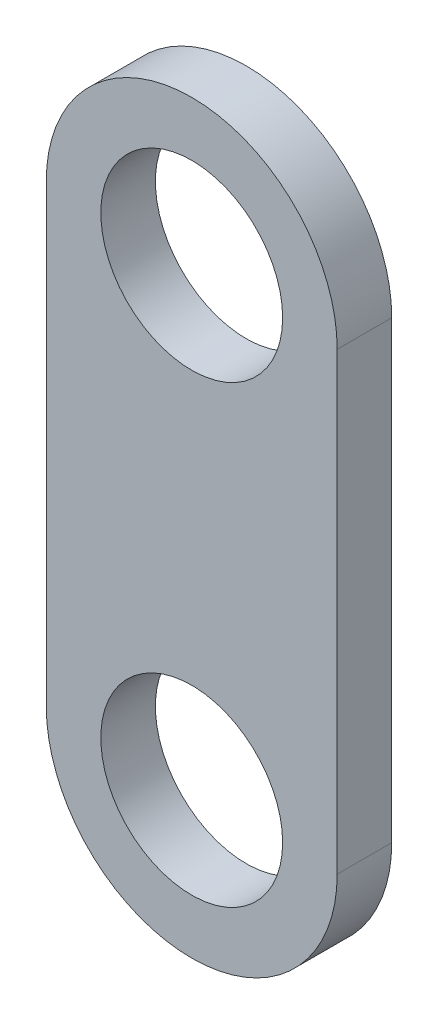
ISO-10303-21;
HEADER;
FILE_DESCRIPTION(('STEP AP214'),'2;1');
FILE_NAME('part.step','',(''),(''),'','','');
FILE_SCHEMA(('AUTOMOTIVE_DESIGN { 1 0 10303 214 1 1 1 1 }'));
ENDSEC;
DATA;
#1=APPLICATION_CONTEXT('core data for automotive mechanical design processes');
#2=APPLICATION_PROTOCOL_DEFINITION('international standard','automotive_design',2000,#1);
#3=PRODUCT_CONTEXT('',#1,'mechanical');
#4=PRODUCT('Part','Part','',(#3));
#5=PRODUCT_RELATED_PRODUCT_CATEGORY('part','',(#4));
#6=PRODUCT_DEFINITION_FORMATION('','',#4);
#7=PRODUCT_DEFINITION_CONTEXT('part definition',#1,'design');
#8=PRODUCT_DEFINITION('design','',#6,#7);
#9=PRODUCT_DEFINITION_SHAPE('','',#8);
#10=(LENGTH_UNIT() NAMED_UNIT(*) SI_UNIT(.MILLI.,.METRE.));
#11=(NAMED_UNIT(*) PLANE_ANGLE_UNIT() SI_UNIT($,.RADIAN.));
#12=(NAMED_UNIT(*) SI_UNIT($,.STERADIAN.) SOLID_ANGLE_UNIT());
#13=UNCERTAINTY_MEASURE_WITH_UNIT(LENGTH_MEASURE(1.E-05),#10,'distance_accuracy_value','');
#14=(GEOMETRIC_REPRESENTATION_CONTEXT(3) GLOBAL_UNCERTAINTY_ASSIGNED_CONTEXT((#13)) GLOBAL_UNIT_ASSIGNED_CONTEXT((#10,
#11,#12)) REPRESENTATION_CONTEXT('',''));
#15=CARTESIAN_POINT('',(0.,0.,0.));
#16=DIRECTION('',(0.,0.,1.));
#17=DIRECTION('',(1.,0.,0.));
#18=AXIS2_PLACEMENT_3D('',#15,#16,#17);
#19=CARTESIAN_POINT('',(0.,-1.25,0.3));
#20=DIRECTION('',(0.,0.,1.));
#21=DIRECTION('',(1.,0.,0.));
#22=AXIS2_PLACEMENT_3D('',#19,#20,#21);
#23=PLANE('',#22);
#24=CARTESIAN_POINT('',(0.,1.25,0.3));
#25=DIRECTION('',(0.,0.,1.));
#26=DIRECTION('',(1.,0.,0.));
#27=AXIS2_PLACEMENT_3D('',#24,#25,#26);
#28=CIRCLE('',#27,0.5);
#29=CARTESIAN_POINT('',(0.5,1.25,0.3));
#30=VERTEX_POINT('',#29);
#31=EDGE_CURVE('E99',#30,#30,#28,.T.);
#32=ORIENTED_EDGE('',*,*,#31,.F.);
#33=EDGE_LOOP('',(#32));
#34=FACE_BOUND('',#33,.T.);
#35=CARTESIAN_POINT('',(0.,-1.25,0.3));
#36=DIRECTION('',(0.,0.,1.));
#37=DIRECTION('',(1.,0.,0.));
#38=AXIS2_PLACEMENT_3D('',#35,#36,#37);
#39=CIRCLE('',#38,0.8);
#40=CARTESIAN_POINT('',(-0.8,-1.25,0.3));
#41=VERTEX_POINT('',#40);
#42=CARTESIAN_POINT('',(0.8,-1.25,0.3));
#43=VERTEX_POINT('',#42);
#44=EDGE_CURVE('E84',#41,#43,#39,.T.);
#45=ORIENTED_EDGE('',*,*,#44,.T.);
#46=DIRECTION('',(0.,1.,0.));
#47=VECTOR('',#46,1.);
#48=CARTESIAN_POINT('',(0.8,-1.25,0.3));
#49=LINE('',#48,#47);
#50=CARTESIAN_POINT('',(0.8,1.25,0.3));
#51=VERTEX_POINT('',#50);
#52=EDGE_CURVE('E79',#43,#51,#49,.T.);
#53=ORIENTED_EDGE('',*,*,#52,.T.);
#54=CARTESIAN_POINT('',(0.,1.25,0.3));
#55=DIRECTION('',(0.,0.,1.));
#56=DIRECTION('',(1.,0.,0.));
#57=AXIS2_PLACEMENT_3D('',#54,#55,#56);
#58=CIRCLE('',#57,0.8);
#59=CARTESIAN_POINT('',(-0.800000000000001,1.25,0.3));
#60=VERTEX_POINT('',#59);
#61=EDGE_CURVE('E82',#51,#60,#58,.T.);
#62=ORIENTED_EDGE('',*,*,#61,.T.);
#63=DIRECTION('',(0.,-1.,0.));
#64=VECTOR('',#63,1.);
#65=CARTESIAN_POINT('',(-0.8,-1.25,0.3));
#66=LINE('',#65,#64);
#67=EDGE_CURVE('E49',#60,#41,#66,.T.);
#68=ORIENTED_EDGE('',*,*,#67,.T.);
#69=EDGE_LOOP('',(#45,#53,#62,#68));
#70=FACE_BOUND('',#69,.T.);
#71=CARTESIAN_POINT('',(0.,-1.25,0.3));
#72=DIRECTION('',(0.,0.,1.));
#73=DIRECTION('',(1.,0.,0.));
#74=AXIS2_PLACEMENT_3D('',#71,#72,#73);
#75=CIRCLE('',#74,0.5);
#76=CARTESIAN_POINT('',(0.5,-1.25,0.3));
#77=VERTEX_POINT('',#76);
#78=EDGE_CURVE('E114',#77,#77,#75,.T.);
#79=ORIENTED_EDGE('',*,*,#78,.F.);
#80=EDGE_LOOP('',(#79));
#81=FACE_BOUND('',#80,.T.);
#82=ADVANCED_FACE('F32',(#34,#70,#81),#23,.T.);
#83=CARTESIAN_POINT('',(0.,-1.25,0.));
#84=DIRECTION('',(0.,0.,1.));
#85=DIRECTION('',(1.,0.,0.));
#86=AXIS2_PLACEMENT_3D('',#83,#84,#85);
#87=PLANE('',#86);
#88=CARTESIAN_POINT('',(0.,-1.25,0.));
#89=DIRECTION('',(0.,0.,1.));
#90=DIRECTION('',(1.,0.,0.));
#91=AXIS2_PLACEMENT_3D('',#88,#89,#90);
#92=CIRCLE('',#91,0.8);
#93=CARTESIAN_POINT('',(-0.8,-1.25,0.));
#94=VERTEX_POINT('',#93);
#95=CARTESIAN_POINT('',(0.8,-1.25,0.));
#96=VERTEX_POINT('',#95);
#97=EDGE_CURVE('E96',#94,#96,#92,.T.);
#98=ORIENTED_EDGE('',*,*,#97,.F.);
#99=DIRECTION('',(0.,-1.,0.));
#100=VECTOR('',#99,1.);
#101=CARTESIAN_POINT('',(-0.8,-1.25,0.));
#102=LINE('',#101,#100);
#103=CARTESIAN_POINT('',(-0.800000000000001,1.25,0.));
#104=VERTEX_POINT('',#103);
#105=EDGE_CURVE('E72',#104,#94,#102,.T.);
#106=ORIENTED_EDGE('',*,*,#105,.F.);
#107=CARTESIAN_POINT('',(0.,1.25,0.));
#108=DIRECTION('',(0.,0.,1.));
#109=DIRECTION('',(1.,0.,0.));
#110=AXIS2_PLACEMENT_3D('',#107,#108,#109);
#111=CIRCLE('',#110,0.8);
#112=CARTESIAN_POINT('',(0.8,1.25,0.));
#113=VERTEX_POINT('',#112);
#114=EDGE_CURVE('E66',#113,#104,#111,.T.);
#115=ORIENTED_EDGE('',*,*,#114,.F.);
#116=DIRECTION('',(0.,1.,0.));
#117=VECTOR('',#116,1.);
#118=CARTESIAN_POINT('',(0.8,-1.25,0.));
#119=LINE('',#118,#117);
#120=EDGE_CURVE('E88',#96,#113,#119,.T.);
#121=ORIENTED_EDGE('',*,*,#120,.F.);
#122=EDGE_LOOP('',(#98,#106,#115,#121));
#123=FACE_BOUND('',#122,.T.);
#124=CARTESIAN_POINT('',(0.,1.25,0.));
#125=DIRECTION('',(0.,0.,1.));
#126=DIRECTION('',(1.,0.,0.));
#127=AXIS2_PLACEMENT_3D('',#124,#125,#126);
#128=CIRCLE('',#127,0.5);
#129=CARTESIAN_POINT('',(0.5,1.25,0.));
#130=VERTEX_POINT('',#129);
#131=EDGE_CURVE('E111',#130,#130,#128,.T.);
#132=ORIENTED_EDGE('',*,*,#131,.T.);
#133=EDGE_LOOP('',(#132));
#134=FACE_BOUND('',#133,.T.);
#135=CARTESIAN_POINT('',(0.,-1.25,0.));
#136=DIRECTION('',(0.,0.,1.));
#137=DIRECTION('',(1.,0.,0.));
#138=AXIS2_PLACEMENT_3D('',#135,#136,#137);
#139=CIRCLE('',#138,0.5);
#140=CARTESIAN_POINT('',(0.5,-1.25,0.));
#141=VERTEX_POINT('',#140);
#142=EDGE_CURVE('E117',#141,#141,#139,.T.);
#143=ORIENTED_EDGE('',*,*,#142,.T.);
#144=EDGE_LOOP('',(#143));
#145=FACE_BOUND('',#144,.T.);
#146=ADVANCED_FACE('F107',(#123,#134,#145),#87,.F.);
#147=CARTESIAN_POINT('',(0.,-1.25,0.3));
#148=DIRECTION('',(0.,0.,-1.));
#149=DIRECTION('',(-1.,0.,0.));
#150=AXIS2_PLACEMENT_3D('',#147,#148,#149);
#151=CYLINDRICAL_SURFACE('',#150,0.8);
#152=ORIENTED_EDGE('',*,*,#97,.T.);
#153=DIRECTION('',(0.,0.,-1.));
#154=VECTOR('',#153,1.);
#155=CARTESIAN_POINT('',(0.8,-1.25,0.3));
#156=LINE('',#155,#154);
#157=EDGE_CURVE('E11',#43,#96,#156,.T.);
#158=ORIENTED_EDGE('',*,*,#157,.F.);
#159=ORIENTED_EDGE('',*,*,#44,.F.);
#160=DIRECTION('',(0.,0.,-1.));
#161=VECTOR('',#160,1.);
#162=CARTESIAN_POINT('',(-0.8,-1.25,0.3));
#163=LINE('',#162,#161);
#164=EDGE_CURVE('E92',#41,#94,#163,.T.);
#165=ORIENTED_EDGE('',*,*,#164,.T.);
#166=EDGE_LOOP('',(#152,#158,#159,#165));
#167=FACE_BOUND('',#166,.T.);
#168=ADVANCED_FACE('F34',(#167),#151,.T.);
#169=CARTESIAN_POINT('',(0.8,-1.25,0.3));
#170=DIRECTION('',(-1.,0.,0.));
#171=DIRECTION('',(0.,-1.,0.));
#172=AXIS2_PLACEMENT_3D('',#169,#170,#171);
#173=PLANE('',#172);
#174=ORIENTED_EDGE('',*,*,#120,.T.);
#175=DIRECTION('',(0.,0.,-1.));
#176=VECTOR('',#175,1.);
#177=CARTESIAN_POINT('',(0.8,1.25,0.3));
#178=LINE('',#177,#176);
#179=EDGE_CURVE('E41',#51,#113,#178,.T.);
#180=ORIENTED_EDGE('',*,*,#179,.F.);
#181=ORIENTED_EDGE('',*,*,#52,.F.);
#182=ORIENTED_EDGE('',*,*,#157,.T.);
#183=EDGE_LOOP('',(#174,#180,#181,#182));
#184=FACE_BOUND('',#183,.T.);
#185=ADVANCED_FACE('F87',(#184),#173,.F.);
#186=CARTESIAN_POINT('',(0.,1.25,0.3));
#187=DIRECTION('',(0.,0.,-1.));
#188=DIRECTION('',(-1.,0.,0.));
#189=AXIS2_PLACEMENT_3D('',#186,#187,#188);
#190=CYLINDRICAL_SURFACE('',#189,0.8);
#191=ORIENTED_EDGE('',*,*,#114,.T.);
#192=DIRECTION('',(0.,0.,-1.));
#193=VECTOR('',#192,1.);
#194=CARTESIAN_POINT('',(-0.800000000000001,1.25,0.3));
#195=LINE('',#194,#193);
#196=EDGE_CURVE('E89',#60,#104,#195,.T.);
#197=ORIENTED_EDGE('',*,*,#196,.F.);
#198=ORIENTED_EDGE('',*,*,#61,.F.);
#199=ORIENTED_EDGE('',*,*,#179,.T.);
#200=EDGE_LOOP('',(#191,#197,#198,#199));
#201=FACE_BOUND('',#200,.T.);
#202=ADVANCED_FACE('F90',(#201),#190,.T.);
#203=CARTESIAN_POINT('',(-0.8,-1.25,0.3));
#204=DIRECTION('',(1.,0.,0.));
#205=DIRECTION('',(0.,1.,0.));
#206=AXIS2_PLACEMENT_3D('',#203,#204,#205);
#207=PLANE('',#206);
#208=ORIENTED_EDGE('',*,*,#105,.T.);
#209=ORIENTED_EDGE('',*,*,#164,.F.);
#210=ORIENTED_EDGE('',*,*,#67,.F.);
#211=ORIENTED_EDGE('',*,*,#196,.T.);
#212=EDGE_LOOP('',(#208,#209,#210,#211));
#213=FACE_BOUND('',#212,.T.);
#214=ADVANCED_FACE('F104',(#213),#207,.F.);
#215=CARTESIAN_POINT('',(0.,1.25,0.3));
#216=DIRECTION('',(0.,0.,-1.));
#217=DIRECTION('',(-1.,0.,0.));
#218=AXIS2_PLACEMENT_3D('',#215,#216,#217);
#219=CYLINDRICAL_SURFACE('',#218,0.5);
#220=ORIENTED_EDGE('',*,*,#31,.T.);
#221=EDGE_LOOP('',(#220));
#222=FACE_BOUND('',#221,.T.);
#223=ORIENTED_EDGE('',*,*,#131,.F.);
#224=EDGE_LOOP('',(#223));
#225=FACE_BOUND('',#224,.T.);
#226=ADVANCED_FACE('F134',(#222,#225),#219,.F.);
#227=CARTESIAN_POINT('',(0.,-1.25,0.3));
#228=DIRECTION('',(0.,0.,-1.));
#229=DIRECTION('',(-1.,0.,0.));
#230=AXIS2_PLACEMENT_3D('',#227,#228,#229);
#231=CYLINDRICAL_SURFACE('',#230,0.5);
#232=ORIENTED_EDGE('',*,*,#78,.T.);
#233=EDGE_LOOP('',(#232));
#234=FACE_BOUND('',#233,.T.);
#235=ORIENTED_EDGE('',*,*,#142,.F.);
#236=EDGE_LOOP('',(#235));
#237=FACE_BOUND('',#236,.T.);
#238=ADVANCED_FACE('F123',(#234,#237),#231,.F.);
#239=CLOSED_SHELL('',(#82,#146,#168,#185,#202,#214,#226,#238));
#240=MANIFOLD_SOLID_BREP('B2',#239);
#241=ADVANCED_BREP_SHAPE_REPRESENTATION('',(#18,#240),#14);
#242=SHAPE_DEFINITION_REPRESENTATION(#9,#241);
ENDSEC;
END-ISO-10303-21;
